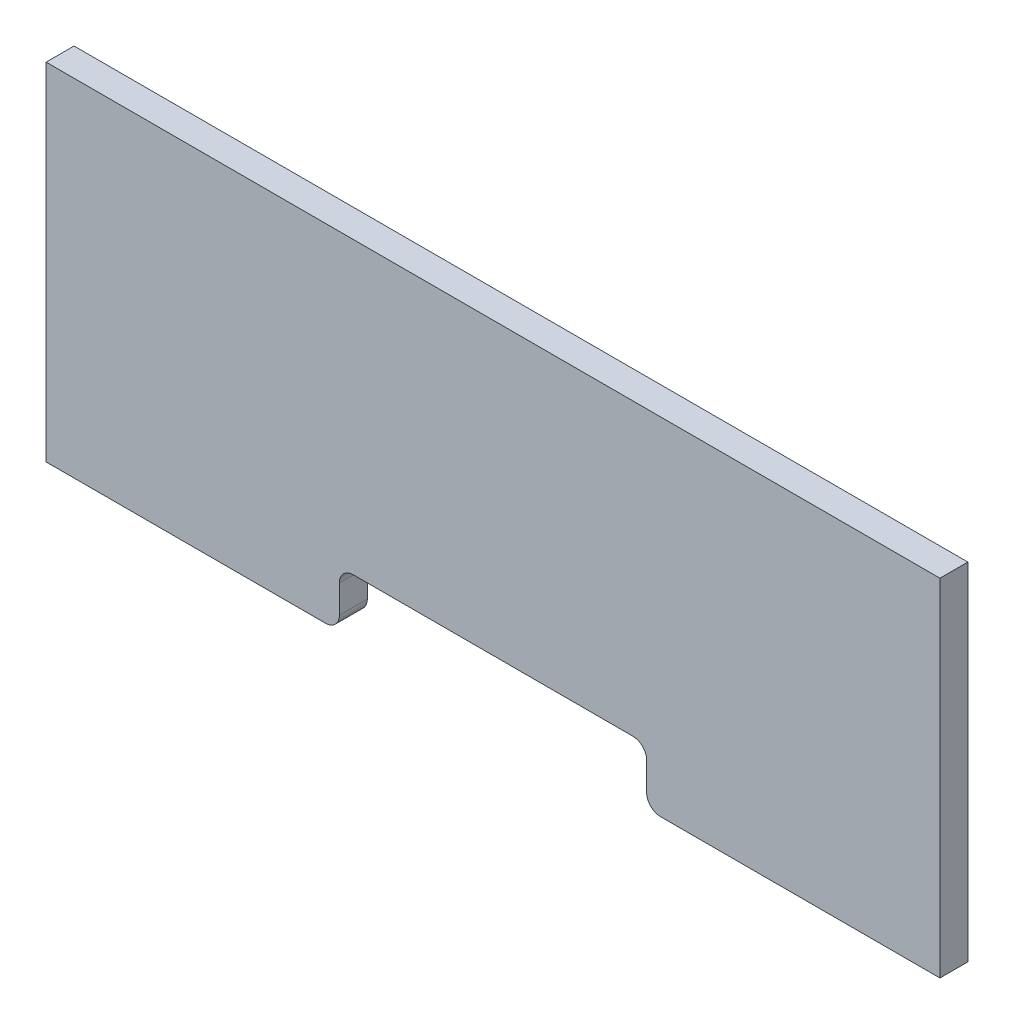
ISO-10303-21;
HEADER;
FILE_DESCRIPTION(('STEP AP214'),'2;1');
FILE_NAME('part.step','',(''),(''),'','','');
FILE_SCHEMA(('AUTOMOTIVE_DESIGN { 1 0 10303 214 1 1 1 1 }'));
ENDSEC;
DATA;
#1=APPLICATION_CONTEXT('core data for automotive mechanical design processes');
#2=APPLICATION_PROTOCOL_DEFINITION('international standard','automotive_design',2000,#1);
#3=PRODUCT_CONTEXT('',#1,'mechanical');
#4=PRODUCT('Part','Part','',(#3));
#5=PRODUCT_RELATED_PRODUCT_CATEGORY('part','',(#4));
#6=PRODUCT_DEFINITION_FORMATION('','',#4);
#7=PRODUCT_DEFINITION_CONTEXT('part definition',#1,'design');
#8=PRODUCT_DEFINITION('design','',#6,#7);
#9=PRODUCT_DEFINITION_SHAPE('','',#8);
#10=(LENGTH_UNIT() NAMED_UNIT(*) SI_UNIT(.MILLI.,.METRE.));
#11=(NAMED_UNIT(*) PLANE_ANGLE_UNIT() SI_UNIT($,.RADIAN.));
#12=(NAMED_UNIT(*) SI_UNIT($,.STERADIAN.) SOLID_ANGLE_UNIT());
#13=UNCERTAINTY_MEASURE_WITH_UNIT(LENGTH_MEASURE(1.E-05),#10,'distance_accuracy_value','');
#14=(GEOMETRIC_REPRESENTATION_CONTEXT(3) GLOBAL_UNCERTAINTY_ASSIGNED_CONTEXT((#13)) GLOBAL_UNIT_ASSIGNED_CONTEXT((#10,
#11,#12)) REPRESENTATION_CONTEXT('',''));
#15=CARTESIAN_POINT('',(0.,0.,0.));
#16=DIRECTION('',(0.,0.,1.));
#17=DIRECTION('',(1.,0.,0.));
#18=AXIS2_PLACEMENT_3D('',#15,#16,#17);
#19=CARTESIAN_POINT('',(0.,0.,6.35));
#20=DIRECTION('',(0.,1.,0.));
#21=DIRECTION('',(0.,0.,1.));
#22=AXIS2_PLACEMENT_3D('',#19,#20,#21);
#23=PLANE('',#22);
#24=DIRECTION('',(1.,0.,0.));
#25=VECTOR('',#24,1.);
#26=CARTESIAN_POINT('',(0.,0.,0.));
#27=LINE('',#26,#25);
#28=CARTESIAN_POINT('',(0.,0.,0.));
#29=VERTEX_POINT('',#28);
#30=CARTESIAN_POINT('',(63.5,0.,0.));
#31=VERTEX_POINT('',#30);
#32=EDGE_CURVE('E255',#29,#31,#27,.T.);
#33=ORIENTED_EDGE('',*,*,#32,.T.);
#34=DIRECTION('',(0.,0.,1.));
#35=VECTOR('',#34,1.);
#36=CARTESIAN_POINT('',(63.5,0.,6.35));
#37=LINE('',#36,#35);
#38=CARTESIAN_POINT('',(63.5,0.,6.35));
#39=VERTEX_POINT('',#38);
#40=EDGE_CURVE('E138',#31,#39,#37,.T.);
#41=ORIENTED_EDGE('',*,*,#40,.T.);
#42=DIRECTION('',(1.,0.,0.));
#43=VECTOR('',#42,1.);
#44=CARTESIAN_POINT('',(0.,0.,6.35));
#45=LINE('',#44,#43);
#46=CARTESIAN_POINT('',(0.,0.,6.35));
#47=VERTEX_POINT('',#46);
#48=EDGE_CURVE('E131',#47,#39,#45,.T.);
#49=ORIENTED_EDGE('',*,*,#48,.F.);
#50=DIRECTION('',(0.,0.,-1.));
#51=VECTOR('',#50,1.);
#52=CARTESIAN_POINT('',(0.,0.,6.35));
#53=LINE('',#52,#51);
#54=EDGE_CURVE('E135',#47,#29,#53,.T.);
#55=ORIENTED_EDGE('',*,*,#54,.T.);
#56=EDGE_LOOP('',(#33,#41,#49,#55));
#57=FACE_BOUND('',#56,.T.);
#58=ADVANCED_FACE('F39',(#57),#23,.F.);
#59=CARTESIAN_POINT('',(0.,0.,6.35));
#60=DIRECTION('',(1.,0.,0.));
#61=DIRECTION('',(0.,0.,-1.));
#62=AXIS2_PLACEMENT_3D('',#59,#60,#61);
#63=PLANE('',#62);
#64=DIRECTION('',(0.,-1.,0.));
#65=VECTOR('',#64,1.);
#66=CARTESIAN_POINT('',(0.,0.,0.));
#67=LINE('',#66,#65);
#68=CARTESIAN_POINT('',(0.,78.7146,0.));
#69=VERTEX_POINT('',#68);
#70=EDGE_CURVE('E158',#69,#29,#67,.T.);
#71=ORIENTED_EDGE('',*,*,#70,.T.);
#72=ORIENTED_EDGE('',*,*,#54,.F.);
#73=DIRECTION('',(0.,-1.,0.));
#74=VECTOR('',#73,1.);
#75=CARTESIAN_POINT('',(0.,0.,6.35));
#76=LINE('',#75,#74);
#77=CARTESIAN_POINT('',(0.,78.7146,6.35));
#78=VERTEX_POINT('',#77);
#79=EDGE_CURVE('E145',#78,#47,#76,.T.);
#80=ORIENTED_EDGE('',*,*,#79,.F.);
#81=DIRECTION('',(0.,0.,-1.));
#82=VECTOR('',#81,1.);
#83=CARTESIAN_POINT('',(0.,78.7146,6.35));
#84=LINE('',#83,#82);
#85=EDGE_CURVE('E251',#78,#69,#84,.T.);
#86=ORIENTED_EDGE('',*,*,#85,.T.);
#87=EDGE_LOOP('',(#71,#72,#80,#86));
#88=FACE_BOUND('',#87,.T.);
#89=ADVANCED_FACE('F156',(#88),#63,.F.);
#90=CARTESIAN_POINT('',(139.7,0.,6.35));
#91=VERTEX_POINT('',#90);
#92=CARTESIAN_POINT('',(203.2,0.,6.35));
#93=VERTEX_POINT('',#92);
#94=EDGE_CURVE('E142',#91,#93,#45,.T.);
#95=ORIENTED_EDGE('',*,*,#94,.F.);
#96=DIRECTION('',(0.,0.,1.));
#97=VECTOR('',#96,1.);
#98=CARTESIAN_POINT('',(139.7,0.,6.35));
#99=LINE('',#98,#97);
#100=CARTESIAN_POINT('',(139.7,0.,0.));
#101=VERTEX_POINT('',#100);
#102=EDGE_CURVE('E181',#91,#101,#99,.F.);
#103=ORIENTED_EDGE('',*,*,#102,.T.);
#104=CARTESIAN_POINT('',(203.2,0.,0.));
#105=VERTEX_POINT('',#104);
#106=EDGE_CURVE('E254',#101,#105,#27,.T.);
#107=ORIENTED_EDGE('',*,*,#106,.T.);
#108=DIRECTION('',(0.,0.,-1.));
#109=VECTOR('',#108,1.);
#110=CARTESIAN_POINT('',(203.2,0.,6.35));
#111=LINE('',#110,#109);
#112=EDGE_CURVE('E161',#93,#105,#111,.T.);
#113=ORIENTED_EDGE('',*,*,#112,.F.);
#114=EDGE_LOOP('',(#95,#103,#107,#113));
#115=FACE_BOUND('',#114,.T.);
#116=ADVANCED_FACE('F281',(#115),#23,.F.);
#117=CARTESIAN_POINT('',(203.2,0.,6.35));
#118=DIRECTION('',(-1.,0.,0.));
#119=DIRECTION('',(0.,0.,1.));
#120=AXIS2_PLACEMENT_3D('',#117,#118,#119);
#121=PLANE('',#120);
#122=DIRECTION('',(0.,1.,0.));
#123=VECTOR('',#122,1.);
#124=CARTESIAN_POINT('',(203.2,0.,0.));
#125=LINE('',#124,#123);
#126=CARTESIAN_POINT('',(203.2,78.7146,0.));
#127=VERTEX_POINT('',#126);
#128=EDGE_CURVE('E258',#105,#127,#125,.T.);
#129=ORIENTED_EDGE('',*,*,#128,.T.);
#130=DIRECTION('',(0.,0.,-1.));
#131=VECTOR('',#130,1.);
#132=CARTESIAN_POINT('',(203.2,78.7146,6.35));
#133=LINE('',#132,#131);
#134=CARTESIAN_POINT('',(203.2,78.7146,6.35));
#135=VERTEX_POINT('',#134);
#136=EDGE_CURVE('E168',#135,#127,#133,.T.);
#137=ORIENTED_EDGE('',*,*,#136,.F.);
#138=DIRECTION('',(0.,1.,0.));
#139=VECTOR('',#138,1.);
#140=CARTESIAN_POINT('',(203.2,0.,6.35));
#141=LINE('',#140,#139);
#142=EDGE_CURVE('E141',#93,#135,#141,.T.);
#143=ORIENTED_EDGE('',*,*,#142,.F.);
#144=ORIENTED_EDGE('',*,*,#112,.T.);
#145=EDGE_LOOP('',(#129,#137,#143,#144));
#146=FACE_BOUND('',#145,.T.);
#147=ADVANCED_FACE('F288',(#146),#121,.F.);
#148=CARTESIAN_POINT('',(0.,78.7146,6.35));
#149=DIRECTION('',(0.,-1.,0.));
#150=DIRECTION('',(0.,0.,-1.));
#151=AXIS2_PLACEMENT_3D('',#148,#149,#150);
#152=PLANE('',#151);
#153=DIRECTION('',(-1.,0.,0.));
#154=VECTOR('',#153,1.);
#155=CARTESIAN_POINT('',(0.,78.7146,0.));
#156=LINE('',#155,#154);
#157=EDGE_CURVE('E154',#127,#69,#156,.T.);
#158=ORIENTED_EDGE('',*,*,#157,.T.);
#159=ORIENTED_EDGE('',*,*,#85,.F.);
#160=DIRECTION('',(-1.,0.,0.));
#161=VECTOR('',#160,1.);
#162=CARTESIAN_POINT('',(0.,78.7146,6.35));
#163=LINE('',#162,#161);
#164=EDGE_CURVE('E149',#135,#78,#163,.T.);
#165=ORIENTED_EDGE('',*,*,#164,.F.);
#166=ORIENTED_EDGE('',*,*,#136,.T.);
#167=EDGE_LOOP('',(#158,#159,#165,#166));
#168=FACE_BOUND('',#167,.T.);
#169=ADVANCED_FACE('F269',(#168),#152,.F.);
#170=CARTESIAN_POINT('',(0.,0.,6.35));
#171=DIRECTION('',(0.,0.,-1.));
#172=DIRECTION('',(-1.,0.,0.));
#173=AXIS2_PLACEMENT_3D('',#170,#171,#172);
#174=PLANE('',#173);
#175=DIRECTION('',(0.,1.,0.));
#176=VECTOR('',#175,1.);
#177=CARTESIAN_POINT('',(136.525,0.,6.35));
#178=LINE('',#177,#176);
#179=CARTESIAN_POINT('',(136.525,3.175,6.35));
#180=VERTEX_POINT('',#179);
#181=CARTESIAN_POINT('',(136.525,9.52500000000001,6.35));
#182=VERTEX_POINT('',#181);
#183=EDGE_CURVE('E221',#180,#182,#178,.T.);
#184=ORIENTED_EDGE('',*,*,#183,.F.);
#185=CARTESIAN_POINT('',(139.7,3.175,6.35));
#186=DIRECTION('',(0.,0.,-1.));
#187=DIRECTION('',(-1.,0.,0.));
#188=AXIS2_PLACEMENT_3D('',#185,#186,#187);
#189=CIRCLE('',#188,3.175);
#190=EDGE_CURVE('E178',#180,#91,#189,.F.);
#191=ORIENTED_EDGE('',*,*,#190,.T.);
#192=ORIENTED_EDGE('',*,*,#94,.T.);
#193=ORIENTED_EDGE('',*,*,#142,.T.);
#194=ORIENTED_EDGE('',*,*,#164,.T.);
#195=ORIENTED_EDGE('',*,*,#79,.T.);
#196=ORIENTED_EDGE('',*,*,#48,.T.);
#197=CARTESIAN_POINT('',(63.5,3.175,6.35));
#198=DIRECTION('',(0.,0.,-1.));
#199=DIRECTION('',(-1.,0.,0.));
#200=AXIS2_PLACEMENT_3D('',#197,#198,#199);
#201=CIRCLE('',#200,3.175);
#202=CARTESIAN_POINT('',(66.675,3.175,6.35));
#203=VERTEX_POINT('',#202);
#204=EDGE_CURVE('E175',#39,#203,#201,.F.);
#205=ORIENTED_EDGE('',*,*,#204,.T.);
#206=DIRECTION('',(0.,-1.,0.));
#207=VECTOR('',#206,1.);
#208=CARTESIAN_POINT('',(66.675,0.,6.35));
#209=LINE('',#208,#207);
#210=CARTESIAN_POINT('',(66.675,9.525,6.35));
#211=VERTEX_POINT('',#210);
#212=EDGE_CURVE('E214',#211,#203,#209,.T.);
#213=ORIENTED_EDGE('',*,*,#212,.F.);
#214=CARTESIAN_POINT('',(69.85,9.525,6.35));
#215=DIRECTION('',(0.,0.,-1.));
#216=DIRECTION('',(-1.,0.,0.));
#217=AXIS2_PLACEMENT_3D('',#214,#215,#216);
#218=CIRCLE('',#217,3.175);
#219=CARTESIAN_POINT('',(69.85,12.7,6.35));
#220=VERTEX_POINT('',#219);
#221=EDGE_CURVE('E48',#211,#220,#218,.T.);
#222=ORIENTED_EDGE('',*,*,#221,.T.);
#223=DIRECTION('',(-1.,0.,0.));
#224=VECTOR('',#223,1.);
#225=CARTESIAN_POINT('',(66.675,12.7,6.35));
#226=LINE('',#225,#224);
#227=CARTESIAN_POINT('',(133.35,12.7,6.35));
#228=VERTEX_POINT('',#227);
#229=EDGE_CURVE('E212',#228,#220,#226,.T.);
#230=ORIENTED_EDGE('',*,*,#229,.F.);
#231=CARTESIAN_POINT('',(133.35,9.52500000000001,6.35));
#232=DIRECTION('',(0.,0.,-1.));
#233=DIRECTION('',(-1.,0.,0.));
#234=AXIS2_PLACEMENT_3D('',#231,#232,#233);
#235=CIRCLE('',#234,3.175);
#236=EDGE_CURVE('E205',#228,#182,#235,.T.);
#237=ORIENTED_EDGE('',*,*,#236,.T.);
#238=EDGE_LOOP('',(#184,#191,#192,#193,#194,#195,#196,#205,#213,#222,#230,#237));
#239=FACE_BOUND('',#238,.T.);
#240=ADVANCED_FACE('F147',(#239),#174,.F.);
#241=CARTESIAN_POINT('',(0.,0.,0.));
#242=DIRECTION('',(0.,0.,-1.));
#243=DIRECTION('',(-1.,0.,0.));
#244=AXIS2_PLACEMENT_3D('',#241,#242,#243);
#245=PLANE('',#244);
#246=ORIENTED_EDGE('',*,*,#106,.F.);
#247=CARTESIAN_POINT('',(139.7,3.175,0.));
#248=DIRECTION('',(0.,0.,-1.));
#249=DIRECTION('',(-1.,0.,0.));
#250=AXIS2_PLACEMENT_3D('',#247,#248,#249);
#251=CIRCLE('',#250,3.175);
#252=CARTESIAN_POINT('',(136.525,3.175,0.));
#253=VERTEX_POINT('',#252);
#254=EDGE_CURVE('E187',#101,#253,#251,.T.);
#255=ORIENTED_EDGE('',*,*,#254,.T.);
#256=DIRECTION('',(0.,1.,0.));
#257=VECTOR('',#256,1.);
#258=CARTESIAN_POINT('',(136.525,0.,0.));
#259=LINE('',#258,#257);
#260=CARTESIAN_POINT('',(136.525,9.52500000000001,0.));
#261=VERTEX_POINT('',#260);
#262=EDGE_CURVE('E235',#253,#261,#259,.T.);
#263=ORIENTED_EDGE('',*,*,#262,.T.);
#264=CARTESIAN_POINT('',(133.35,9.52500000000001,0.));
#265=DIRECTION('',(0.,0.,-1.));
#266=DIRECTION('',(-1.,0.,0.));
#267=AXIS2_PLACEMENT_3D('',#264,#265,#266);
#268=CIRCLE('',#267,3.175);
#269=CARTESIAN_POINT('',(133.35,12.7,0.));
#270=VERTEX_POINT('',#269);
#271=EDGE_CURVE('E62',#261,#270,#268,.F.);
#272=ORIENTED_EDGE('',*,*,#271,.T.);
#273=DIRECTION('',(-1.,0.,0.));
#274=VECTOR('',#273,1.);
#275=CARTESIAN_POINT('',(66.675,12.7,0.));
#276=LINE('',#275,#274);
#277=CARTESIAN_POINT('',(69.85,12.7,0.));
#278=VERTEX_POINT('',#277);
#279=EDGE_CURVE('E230',#270,#278,#276,.T.);
#280=ORIENTED_EDGE('',*,*,#279,.T.);
#281=CARTESIAN_POINT('',(69.85,9.525,0.));
#282=DIRECTION('',(0.,0.,-1.));
#283=DIRECTION('',(-1.,0.,0.));
#284=AXIS2_PLACEMENT_3D('',#281,#282,#283);
#285=CIRCLE('',#284,3.175);
#286=CARTESIAN_POINT('',(66.675,9.525,0.));
#287=VERTEX_POINT('',#286);
#288=EDGE_CURVE('E11',#278,#287,#285,.F.);
#289=ORIENTED_EDGE('',*,*,#288,.T.);
#290=DIRECTION('',(0.,-1.,0.));
#291=VECTOR('',#290,1.);
#292=CARTESIAN_POINT('',(66.675,0.,0.));
#293=LINE('',#292,#291);
#294=CARTESIAN_POINT('',(66.675,3.175,0.));
#295=VERTEX_POINT('',#294);
#296=EDGE_CURVE('E220',#287,#295,#293,.T.);
#297=ORIENTED_EDGE('',*,*,#296,.T.);
#298=CARTESIAN_POINT('',(63.5,3.175,0.));
#299=DIRECTION('',(0.,0.,-1.));
#300=DIRECTION('',(-1.,0.,0.));
#301=AXIS2_PLACEMENT_3D('',#298,#299,#300);
#302=CIRCLE('',#301,3.175);
#303=EDGE_CURVE('E184',#295,#31,#302,.T.);
#304=ORIENTED_EDGE('',*,*,#303,.T.);
#305=ORIENTED_EDGE('',*,*,#32,.F.);
#306=ORIENTED_EDGE('',*,*,#70,.F.);
#307=ORIENTED_EDGE('',*,*,#157,.F.);
#308=ORIENTED_EDGE('',*,*,#128,.F.);
#309=EDGE_LOOP('',(#246,#255,#263,#272,#280,#289,#297,#304,#305,#306,#307,#308));
#310=FACE_BOUND('',#309,.T.);
#311=ADVANCED_FACE('F228',(#310),#245,.T.);
#312=CARTESIAN_POINT('',(66.675,0.,0.));
#313=DIRECTION('',(-1.,0.,0.));
#314=DIRECTION('',(0.,0.,1.));
#315=AXIS2_PLACEMENT_3D('',#312,#313,#314);
#316=PLANE('',#315);
#317=ORIENTED_EDGE('',*,*,#296,.F.);
#318=DIRECTION('',(0.,0.,1.));
#319=VECTOR('',#318,1.);
#320=CARTESIAN_POINT('',(66.675,9.525,6.35));
#321=LINE('',#320,#319);
#322=EDGE_CURVE('E199',#287,#211,#321,.T.);
#323=ORIENTED_EDGE('',*,*,#322,.T.);
#324=ORIENTED_EDGE('',*,*,#212,.T.);
#325=DIRECTION('',(0.,0.,1.));
#326=VECTOR('',#325,1.);
#327=CARTESIAN_POINT('',(66.675,3.175,0.));
#328=LINE('',#327,#326);
#329=EDGE_CURVE('E196',#203,#295,#328,.F.);
#330=ORIENTED_EDGE('',*,*,#329,.T.);
#331=EDGE_LOOP('',(#317,#323,#324,#330));
#332=FACE_BOUND('',#331,.T.);
#333=ADVANCED_FACE('F232',(#332),#316,.F.);
#334=CARTESIAN_POINT('',(66.675,12.7,0.));
#335=DIRECTION('',(0.,1.,0.));
#336=DIRECTION('',(-1.,0.,0.));
#337=AXIS2_PLACEMENT_3D('',#334,#335,#336);
#338=PLANE('',#337);
#339=ORIENTED_EDGE('',*,*,#279,.F.);
#340=DIRECTION('',(0.,0.,1.));
#341=VECTOR('',#340,1.);
#342=CARTESIAN_POINT('',(133.35,12.7,6.35));
#343=LINE('',#342,#341);
#344=EDGE_CURVE('E192',#270,#228,#343,.T.);
#345=ORIENTED_EDGE('',*,*,#344,.T.);
#346=ORIENTED_EDGE('',*,*,#229,.T.);
#347=DIRECTION('',(0.,0.,1.));
#348=VECTOR('',#347,1.);
#349=CARTESIAN_POINT('',(69.85,12.7,0.));
#350=LINE('',#349,#348);
#351=EDGE_CURVE('E55',#220,#278,#350,.F.);
#352=ORIENTED_EDGE('',*,*,#351,.T.);
#353=EDGE_LOOP('',(#339,#345,#346,#352));
#354=FACE_BOUND('',#353,.T.);
#355=ADVANCED_FACE('F217',(#354),#338,.F.);
#356=CARTESIAN_POINT('',(136.525,0.,0.));
#357=DIRECTION('',(1.,0.,0.));
#358=DIRECTION('',(0.,0.,-1.));
#359=AXIS2_PLACEMENT_3D('',#356,#357,#358);
#360=PLANE('',#359);
#361=ORIENTED_EDGE('',*,*,#262,.F.);
#362=DIRECTION('',(0.,0.,1.));
#363=VECTOR('',#362,1.);
#364=CARTESIAN_POINT('',(136.525,3.175,0.));
#365=LINE('',#364,#363);
#366=EDGE_CURVE('E165',#253,#180,#365,.T.);
#367=ORIENTED_EDGE('',*,*,#366,.T.);
#368=ORIENTED_EDGE('',*,*,#183,.T.);
#369=DIRECTION('',(0.,0.,1.));
#370=VECTOR('',#369,1.);
#371=CARTESIAN_POINT('',(136.525,9.52500000000001,0.));
#372=LINE('',#371,#370);
#373=EDGE_CURVE('E160',#182,#261,#372,.F.);
#374=ORIENTED_EDGE('',*,*,#373,.T.);
#375=EDGE_LOOP('',(#361,#367,#368,#374));
#376=FACE_BOUND('',#375,.T.);
#377=ADVANCED_FACE('F303',(#376),#360,.F.);
#378=CARTESIAN_POINT('',(139.7,3.175,0.));
#379=DIRECTION('',(0.,0.,1.));
#380=DIRECTION('',(1.,0.,0.));
#381=AXIS2_PLACEMENT_3D('',#378,#379,#380);
#382=CYLINDRICAL_SURFACE('',#381,3.175);
#383=ORIENTED_EDGE('',*,*,#254,.F.);
#384=ORIENTED_EDGE('',*,*,#102,.F.);
#385=ORIENTED_EDGE('',*,*,#190,.F.);
#386=ORIENTED_EDGE('',*,*,#366,.F.);
#387=EDGE_LOOP('',(#383,#384,#385,#386));
#388=FACE_BOUND('',#387,.T.);
#389=ADVANCED_FACE('F299',(#388),#382,.T.);
#390=CARTESIAN_POINT('',(133.35,9.52500000000001,0.));
#391=DIRECTION('',(0.,0.,-1.));
#392=DIRECTION('',(-1.,0.,0.));
#393=AXIS2_PLACEMENT_3D('',#390,#391,#392);
#394=CYLINDRICAL_SURFACE('',#393,3.175);
#395=ORIENTED_EDGE('',*,*,#271,.F.);
#396=ORIENTED_EDGE('',*,*,#373,.F.);
#397=ORIENTED_EDGE('',*,*,#236,.F.);
#398=ORIENTED_EDGE('',*,*,#344,.F.);
#399=EDGE_LOOP('',(#395,#396,#397,#398));
#400=FACE_BOUND('',#399,.T.);
#401=ADVANCED_FACE('F278',(#400),#394,.F.);
#402=CARTESIAN_POINT('',(69.85,9.525,0.));
#403=DIRECTION('',(0.,0.,-1.));
#404=DIRECTION('',(-1.,0.,0.));
#405=AXIS2_PLACEMENT_3D('',#402,#403,#404);
#406=CYLINDRICAL_SURFACE('',#405,3.175);
#407=ORIENTED_EDGE('',*,*,#288,.F.);
#408=ORIENTED_EDGE('',*,*,#351,.F.);
#409=ORIENTED_EDGE('',*,*,#221,.F.);
#410=ORIENTED_EDGE('',*,*,#322,.F.);
#411=EDGE_LOOP('',(#407,#408,#409,#410));
#412=FACE_BOUND('',#411,.T.);
#413=ADVANCED_FACE('F224',(#412),#406,.F.);
#414=CARTESIAN_POINT('',(63.5,3.175,6.35));
#415=DIRECTION('',(0.,0.,1.));
#416=DIRECTION('',(1.,0.,0.));
#417=AXIS2_PLACEMENT_3D('',#414,#415,#416);
#418=CYLINDRICAL_SURFACE('',#417,3.175);
#419=ORIENTED_EDGE('',*,*,#303,.F.);
#420=ORIENTED_EDGE('',*,*,#329,.F.);
#421=ORIENTED_EDGE('',*,*,#204,.F.);
#422=ORIENTED_EDGE('',*,*,#40,.F.);
#423=EDGE_LOOP('',(#419,#420,#421,#422));
#424=FACE_BOUND('',#423,.T.);
#425=ADVANCED_FACE('F41',(#424),#418,.T.);
#426=CLOSED_SHELL('',(#58,#89,#116,#147,#169,#240,#311,#333,#355,#377,#389,#401,#413,#425));
#427=MANIFOLD_SOLID_BREP('B2',#426);
#428=ADVANCED_BREP_SHAPE_REPRESENTATION('',(#18,#427),#14);
#429=SHAPE_DEFINITION_REPRESENTATION(#9,#428);
ENDSEC;
END-ISO-10303-21;
